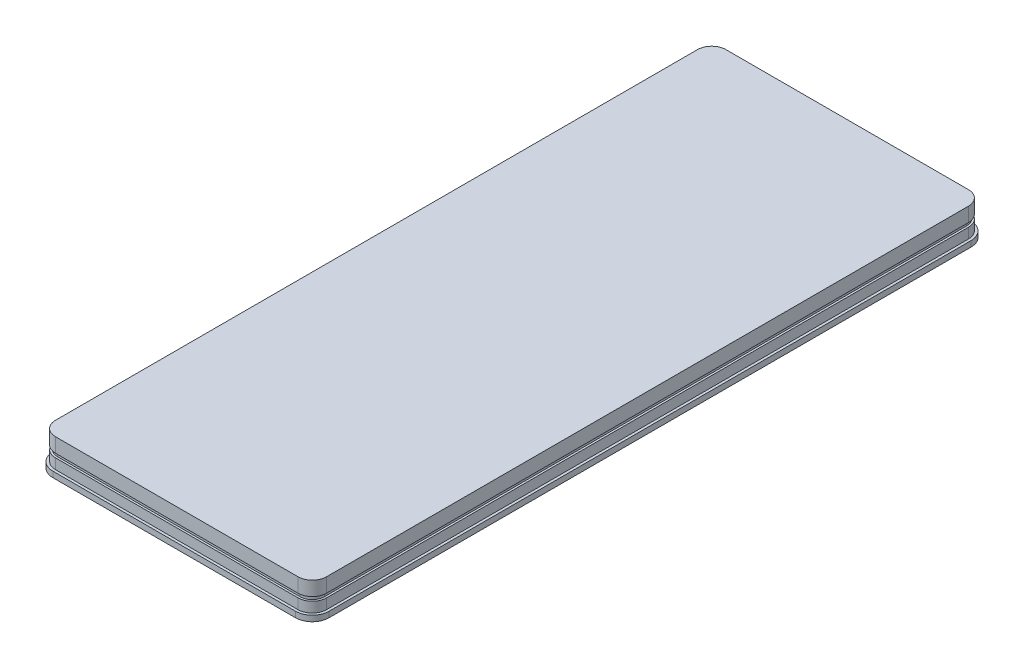
ISO-10303-21;
HEADER;
FILE_DESCRIPTION(('STEP AP214'),'2;1');
FILE_NAME('part.step','',(''),(''),'','','');
FILE_SCHEMA(('AUTOMOTIVE_DESIGN { 1 0 10303 214 1 1 1 1 }'));
ENDSEC;
DATA;
#1=APPLICATION_CONTEXT('core data for automotive mechanical design processes');
#2=APPLICATION_PROTOCOL_DEFINITION('international standard','automotive_design',2000,#1);
#3=PRODUCT_CONTEXT('',#1,'mechanical');
#4=PRODUCT('Part','Part','',(#3));
#5=PRODUCT_RELATED_PRODUCT_CATEGORY('part','',(#4));
#6=PRODUCT_DEFINITION_FORMATION('','',#4);
#7=PRODUCT_DEFINITION_CONTEXT('part definition',#1,'design');
#8=PRODUCT_DEFINITION('design','',#6,#7);
#9=PRODUCT_DEFINITION_SHAPE('','',#8);
#10=(LENGTH_UNIT() NAMED_UNIT(*) SI_UNIT(.MILLI.,.METRE.));
#11=(NAMED_UNIT(*) PLANE_ANGLE_UNIT() SI_UNIT($,.RADIAN.));
#12=(NAMED_UNIT(*) SI_UNIT($,.STERADIAN.) SOLID_ANGLE_UNIT());
#13=UNCERTAINTY_MEASURE_WITH_UNIT(LENGTH_MEASURE(1.E-05),#10,'distance_accuracy_value','');
#14=(GEOMETRIC_REPRESENTATION_CONTEXT(3) GLOBAL_UNCERTAINTY_ASSIGNED_CONTEXT((#13)) GLOBAL_UNIT_ASSIGNED_CONTEXT((#10,
#11,#12)) REPRESENTATION_CONTEXT('',''));
#15=CARTESIAN_POINT('',(0.,0.,0.));
#16=DIRECTION('',(0.,0.,1.));
#17=DIRECTION('',(1.,0.,0.));
#18=AXIS2_PLACEMENT_3D('',#15,#16,#17);
#19=CARTESIAN_POINT('',(-42.5,10.,112.5));
#20=DIRECTION('',(0.,-1.,0.));
#21=DIRECTION('',(0.,0.,-1.));
#22=AXIS2_PLACEMENT_3D('',#19,#20,#21);
#23=CYLINDRICAL_SURFACE('',#22,5.);
#24=CARTESIAN_POINT('',(-42.5,3.6,112.5));
#25=DIRECTION('',(0.,1.,0.));
#26=DIRECTION('',(0.,0.,1.));
#27=AXIS2_PLACEMENT_3D('',#24,#25,#26);
#28=CIRCLE('',#27,5.);
#29=CARTESIAN_POINT('',(-47.5,3.6,112.5));
#30=VERTEX_POINT('',#29);
#31=CARTESIAN_POINT('',(-42.5,3.6,117.5));
#32=VERTEX_POINT('',#31);
#33=EDGE_CURVE('E290',#30,#32,#28,.T.);
#34=ORIENTED_EDGE('',*,*,#33,.F.);
#35=DIRECTION('',(0.,-1.,0.));
#36=VECTOR('',#35,1.);
#37=CARTESIAN_POINT('',(-47.5,10.,112.5));
#38=LINE('',#37,#36);
#39=CARTESIAN_POINT('',(-47.5,0.,112.5));
#40=VERTEX_POINT('',#39);
#41=EDGE_CURVE('E430',#30,#40,#38,.T.);
#42=ORIENTED_EDGE('',*,*,#41,.T.);
#43=CARTESIAN_POINT('',(-42.5,0.,112.5));
#44=DIRECTION('',(0.,1.,0.));
#45=DIRECTION('',(0.,0.,1.));
#46=AXIS2_PLACEMENT_3D('',#43,#44,#45);
#47=CIRCLE('',#46,5.);
#48=CARTESIAN_POINT('',(-42.5,0.,117.5));
#49=VERTEX_POINT('',#48);
#50=EDGE_CURVE('E411',#40,#49,#47,.T.);
#51=ORIENTED_EDGE('',*,*,#50,.T.);
#52=DIRECTION('',(0.,-1.,0.));
#53=VECTOR('',#52,1.);
#54=CARTESIAN_POINT('',(-42.5,10.,117.5));
#55=LINE('',#54,#53);
#56=EDGE_CURVE('E45',#32,#49,#55,.T.);
#57=ORIENTED_EDGE('',*,*,#56,.F.);
#58=EDGE_LOOP('',(#34,#42,#51,#57));
#59=FACE_BOUND('',#58,.T.);
#60=ADVANCED_FACE('F37',(#59),#23,.T.);
#61=CARTESIAN_POINT('',(-42.5,10.,117.5));
#62=DIRECTION('',(0.,0.,-1.));
#63=DIRECTION('',(-1.,0.,0.));
#64=AXIS2_PLACEMENT_3D('',#61,#62,#63);
#65=PLANE('',#64);
#66=DIRECTION('',(1.,0.,0.));
#67=VECTOR('',#66,1.);
#68=CARTESIAN_POINT('',(0.,3.6,117.5));
#69=LINE('',#68,#67);
#70=CARTESIAN_POINT('',(42.5,3.6,117.5));
#71=VERTEX_POINT('',#70);
#72=EDGE_CURVE('E292',#32,#71,#69,.T.);
#73=ORIENTED_EDGE('',*,*,#72,.F.);
#74=ORIENTED_EDGE('',*,*,#56,.T.);
#75=DIRECTION('',(1.,0.,0.));
#76=VECTOR('',#75,1.);
#77=CARTESIAN_POINT('',(-42.5,0.,117.5));
#78=LINE('',#77,#76);
#79=CARTESIAN_POINT('',(42.5,0.,117.5));
#80=VERTEX_POINT('',#79);
#81=EDGE_CURVE('E433',#49,#80,#78,.T.);
#82=ORIENTED_EDGE('',*,*,#81,.T.);
#83=DIRECTION('',(0.,-1.,0.));
#84=VECTOR('',#83,1.);
#85=CARTESIAN_POINT('',(42.5,10.,117.5));
#86=LINE('',#85,#84);
#87=EDGE_CURVE('E475',#71,#80,#86,.T.);
#88=ORIENTED_EDGE('',*,*,#87,.F.);
#89=EDGE_LOOP('',(#73,#74,#82,#88));
#90=FACE_BOUND('',#89,.T.);
#91=ADVANCED_FACE('F496',(#90),#65,.F.);
#92=CARTESIAN_POINT('',(42.5,10.,112.5));
#93=DIRECTION('',(0.,-1.,0.));
#94=DIRECTION('',(0.,0.,-1.));
#95=AXIS2_PLACEMENT_3D('',#92,#93,#94);
#96=CYLINDRICAL_SURFACE('',#95,5.);
#97=CARTESIAN_POINT('',(42.5,3.6,112.5));
#98=DIRECTION('',(0.,1.,0.));
#99=DIRECTION('',(0.,0.,1.));
#100=AXIS2_PLACEMENT_3D('',#97,#98,#99);
#101=CIRCLE('',#100,5.);
#102=CARTESIAN_POINT('',(47.5,3.6,112.5));
#103=VERTEX_POINT('',#102);
#104=EDGE_CURVE('E294',#71,#103,#101,.T.);
#105=ORIENTED_EDGE('',*,*,#104,.F.);
#106=ORIENTED_EDGE('',*,*,#87,.T.);
#107=CARTESIAN_POINT('',(42.5,0.,112.5));
#108=DIRECTION('',(0.,1.,0.));
#109=DIRECTION('',(0.,0.,1.));
#110=AXIS2_PLACEMENT_3D('',#107,#108,#109);
#111=CIRCLE('',#110,5.);
#112=CARTESIAN_POINT('',(47.5,0.,112.5));
#113=VERTEX_POINT('',#112);
#114=EDGE_CURVE('E436',#80,#113,#111,.T.);
#115=ORIENTED_EDGE('',*,*,#114,.T.);
#116=DIRECTION('',(0.,-1.,0.));
#117=VECTOR('',#116,1.);
#118=CARTESIAN_POINT('',(47.5,10.,112.5));
#119=LINE('',#118,#117);
#120=EDGE_CURVE('E472',#103,#113,#119,.T.);
#121=ORIENTED_EDGE('',*,*,#120,.F.);
#122=EDGE_LOOP('',(#105,#106,#115,#121));
#123=FACE_BOUND('',#122,.T.);
#124=ADVANCED_FACE('F485',(#123),#96,.T.);
#125=CARTESIAN_POINT('',(47.5,10.,112.5));
#126=DIRECTION('',(-1.,0.,0.));
#127=DIRECTION('',(0.,0.,1.));
#128=AXIS2_PLACEMENT_3D('',#125,#126,#127);
#129=PLANE('',#128);
#130=DIRECTION('',(0.,0.,-1.));
#131=VECTOR('',#130,1.);
#132=CARTESIAN_POINT('',(47.5,3.6,0.));
#133=LINE('',#132,#131);
#134=CARTESIAN_POINT('',(47.5,3.6,-112.5));
#135=VERTEX_POINT('',#134);
#136=EDGE_CURVE('E296',#103,#135,#133,.T.);
#137=ORIENTED_EDGE('',*,*,#136,.F.);
#138=ORIENTED_EDGE('',*,*,#120,.T.);
#139=DIRECTION('',(0.,0.,-1.));
#140=VECTOR('',#139,1.);
#141=CARTESIAN_POINT('',(47.5,0.,112.5));
#142=LINE('',#141,#140);
#143=CARTESIAN_POINT('',(47.5,0.,-112.5));
#144=VERTEX_POINT('',#143);
#145=EDGE_CURVE('E439',#113,#144,#142,.T.);
#146=ORIENTED_EDGE('',*,*,#145,.T.);
#147=DIRECTION('',(0.,-1.,0.));
#148=VECTOR('',#147,1.);
#149=CARTESIAN_POINT('',(47.5,10.,-112.5));
#150=LINE('',#149,#148);
#151=EDGE_CURVE('E468',#135,#144,#150,.T.);
#152=ORIENTED_EDGE('',*,*,#151,.F.);
#153=EDGE_LOOP('',(#137,#138,#146,#152));
#154=FACE_BOUND('',#153,.T.);
#155=ADVANCED_FACE('F520',(#154),#129,.F.);
#156=CARTESIAN_POINT('',(42.5,10.,-112.5));
#157=DIRECTION('',(0.,-1.,0.));
#158=DIRECTION('',(0.,0.,-1.));
#159=AXIS2_PLACEMENT_3D('',#156,#157,#158);
#160=CYLINDRICAL_SURFACE('',#159,5.);
#161=CARTESIAN_POINT('',(42.5,3.6,-112.5));
#162=DIRECTION('',(0.,1.,0.));
#163=DIRECTION('',(0.,0.,1.));
#164=AXIS2_PLACEMENT_3D('',#161,#162,#163);
#165=CIRCLE('',#164,5.);
#166=CARTESIAN_POINT('',(42.4999999999999,3.6,-117.5));
#167=VERTEX_POINT('',#166);
#168=EDGE_CURVE('E298',#135,#167,#165,.T.);
#169=ORIENTED_EDGE('',*,*,#168,.F.);
#170=ORIENTED_EDGE('',*,*,#151,.T.);
#171=CARTESIAN_POINT('',(42.5,0.,-112.5));
#172=DIRECTION('',(0.,1.,0.));
#173=DIRECTION('',(0.,0.,1.));
#174=AXIS2_PLACEMENT_3D('',#171,#172,#173);
#175=CIRCLE('',#174,5.);
#176=CARTESIAN_POINT('',(42.5,0.,-117.5));
#177=VERTEX_POINT('',#176);
#178=EDGE_CURVE('E442',#144,#177,#175,.T.);
#179=ORIENTED_EDGE('',*,*,#178,.T.);
#180=DIRECTION('',(0.,-1.,0.));
#181=VECTOR('',#180,1.);
#182=CARTESIAN_POINT('',(42.5,10.,-117.5));
#183=LINE('',#182,#181);
#184=EDGE_CURVE('E464',#167,#177,#183,.T.);
#185=ORIENTED_EDGE('',*,*,#184,.F.);
#186=EDGE_LOOP('',(#169,#170,#179,#185));
#187=FACE_BOUND('',#186,.T.);
#188=ADVANCED_FACE('F516',(#187),#160,.T.);
#189=CARTESIAN_POINT('',(-42.5,10.,-117.5));
#190=DIRECTION('',(0.,0.,1.));
#191=DIRECTION('',(1.,0.,0.));
#192=AXIS2_PLACEMENT_3D('',#189,#190,#191);
#193=PLANE('',#192);
#194=DIRECTION('',(-1.,0.,0.));
#195=VECTOR('',#194,1.);
#196=CARTESIAN_POINT('',(0.,3.6,-117.5));
#197=LINE('',#196,#195);
#198=CARTESIAN_POINT('',(-42.5,3.6,-117.5));
#199=VERTEX_POINT('',#198);
#200=EDGE_CURVE('E300',#167,#199,#197,.T.);
#201=ORIENTED_EDGE('',*,*,#200,.F.);
#202=ORIENTED_EDGE('',*,*,#184,.T.);
#203=DIRECTION('',(-1.,0.,0.));
#204=VECTOR('',#203,1.);
#205=CARTESIAN_POINT('',(-42.5,0.,-117.5));
#206=LINE('',#205,#204);
#207=CARTESIAN_POINT('',(-42.5,0.,-117.5));
#208=VERTEX_POINT('',#207);
#209=EDGE_CURVE('E445',#177,#208,#206,.T.);
#210=ORIENTED_EDGE('',*,*,#209,.T.);
#211=DIRECTION('',(0.,-1.,0.));
#212=VECTOR('',#211,1.);
#213=CARTESIAN_POINT('',(-42.5,10.,-117.5));
#214=LINE('',#213,#212);
#215=EDGE_CURVE('E460',#199,#208,#214,.T.);
#216=ORIENTED_EDGE('',*,*,#215,.F.);
#217=EDGE_LOOP('',(#201,#202,#210,#216));
#218=FACE_BOUND('',#217,.T.);
#219=ADVANCED_FACE('F512',(#218),#193,.F.);
#220=CARTESIAN_POINT('',(-42.5,10.,-112.5));
#221=DIRECTION('',(0.,-1.,0.));
#222=DIRECTION('',(0.,0.,-1.));
#223=AXIS2_PLACEMENT_3D('',#220,#221,#222);
#224=CYLINDRICAL_SURFACE('',#223,5.);
#225=CARTESIAN_POINT('',(-42.5,3.6,-112.5));
#226=DIRECTION('',(0.,1.,0.));
#227=DIRECTION('',(0.,0.,1.));
#228=AXIS2_PLACEMENT_3D('',#225,#226,#227);
#229=CIRCLE('',#228,5.);
#230=CARTESIAN_POINT('',(-47.5,3.6,-112.5));
#231=VERTEX_POINT('',#230);
#232=EDGE_CURVE('E52',#199,#231,#229,.T.);
#233=ORIENTED_EDGE('',*,*,#232,.F.);
#234=ORIENTED_EDGE('',*,*,#215,.T.);
#235=CARTESIAN_POINT('',(-42.5,0.,-112.5));
#236=DIRECTION('',(0.,1.,0.));
#237=DIRECTION('',(0.,0.,-1.));
#238=AXIS2_PLACEMENT_3D('',#235,#236,#237);
#239=CIRCLE('',#238,5.);
#240=CARTESIAN_POINT('',(-47.5,0.,-112.5));
#241=VERTEX_POINT('',#240);
#242=EDGE_CURVE('E448',#208,#241,#239,.T.);
#243=ORIENTED_EDGE('',*,*,#242,.T.);
#244=DIRECTION('',(0.,-1.,0.));
#245=VECTOR('',#244,1.);
#246=CARTESIAN_POINT('',(-47.5,10.,-112.5));
#247=LINE('',#246,#245);
#248=EDGE_CURVE('E456',#231,#241,#247,.T.);
#249=ORIENTED_EDGE('',*,*,#248,.F.);
#250=EDGE_LOOP('',(#233,#234,#243,#249));
#251=FACE_BOUND('',#250,.T.);
#252=ADVANCED_FACE('F507',(#251),#224,.T.);
#253=CARTESIAN_POINT('',(-47.5,10.,112.5));
#254=DIRECTION('',(1.,0.,0.));
#255=DIRECTION('',(0.,0.,-1.));
#256=AXIS2_PLACEMENT_3D('',#253,#254,#255);
#257=PLANE('',#256);
#258=DIRECTION('',(0.,0.,1.));
#259=VECTOR('',#258,1.);
#260=CARTESIAN_POINT('',(-47.5,3.6,0.));
#261=LINE('',#260,#259);
#262=EDGE_CURVE('E288',#231,#30,#261,.T.);
#263=ORIENTED_EDGE('',*,*,#262,.F.);
#264=ORIENTED_EDGE('',*,*,#248,.T.);
#265=DIRECTION('',(0.,0.,1.));
#266=VECTOR('',#265,1.);
#267=CARTESIAN_POINT('',(-47.5,0.,112.5));
#268=LINE('',#267,#266);
#269=EDGE_CURVE('E416',#241,#40,#268,.T.);
#270=ORIENTED_EDGE('',*,*,#269,.T.);
#271=ORIENTED_EDGE('',*,*,#41,.F.);
#272=EDGE_LOOP('',(#263,#264,#270,#271));
#273=FACE_BOUND('',#272,.T.);
#274=ADVANCED_FACE('F504',(#273),#257,.F.);
#275=CARTESIAN_POINT('',(-42.5,-2.,112.5));
#276=DIRECTION('',(0.,1.,0.));
#277=DIRECTION('',(0.,0.,1.));
#278=AXIS2_PLACEMENT_3D('',#275,#276,#277);
#279=CYLINDRICAL_SURFACE('',#278,5.9);
#280=CARTESIAN_POINT('',(-42.5,0.,112.5));
#281=DIRECTION('',(0.,-1.,0.));
#282=DIRECTION('',(0.,0.,-1.));
#283=AXIS2_PLACEMENT_3D('',#280,#281,#282);
#284=CIRCLE('',#283,5.9);
#285=CARTESIAN_POINT('',(-42.5,0.,118.4));
#286=VERTEX_POINT('',#285);
#287=CARTESIAN_POINT('',(-48.4,0.,112.5));
#288=VERTEX_POINT('',#287);
#289=EDGE_CURVE('E337',#286,#288,#284,.T.);
#290=ORIENTED_EDGE('',*,*,#289,.T.);
#291=DIRECTION('',(0.,1.,0.));
#292=VECTOR('',#291,1.);
#293=CARTESIAN_POINT('',(-48.4,-2.,112.5));
#294=LINE('',#293,#292);
#295=CARTESIAN_POINT('',(-48.4,-2.,112.5));
#296=VERTEX_POINT('',#295);
#297=EDGE_CURVE('E408',#296,#288,#294,.T.);
#298=ORIENTED_EDGE('',*,*,#297,.F.);
#299=CARTESIAN_POINT('',(-42.5,-2.,112.5));
#300=DIRECTION('',(0.,-1.,0.));
#301=DIRECTION('',(0.,0.,-1.));
#302=AXIS2_PLACEMENT_3D('',#299,#300,#301);
#303=CIRCLE('',#302,5.9);
#304=CARTESIAN_POINT('',(-42.5,-2.,118.4));
#305=VERTEX_POINT('',#304);
#306=EDGE_CURVE('E354',#305,#296,#303,.T.);
#307=ORIENTED_EDGE('',*,*,#306,.F.);
#308=DIRECTION('',(0.,1.,0.));
#309=VECTOR('',#308,1.);
#310=CARTESIAN_POINT('',(-42.5,-2.,118.4));
#311=LINE('',#310,#309);
#312=EDGE_CURVE('E372',#305,#286,#311,.T.);
#313=ORIENTED_EDGE('',*,*,#312,.T.);
#314=EDGE_LOOP('',(#290,#298,#307,#313));
#315=FACE_BOUND('',#314,.T.);
#316=ADVANCED_FACE('F579',(#315),#279,.T.);
#317=CARTESIAN_POINT('',(-48.4,-2.,112.5));
#318=DIRECTION('',(1.,0.,0.));
#319=DIRECTION('',(0.,0.,-1.));
#320=AXIS2_PLACEMENT_3D('',#317,#318,#319);
#321=PLANE('',#320);
#322=DIRECTION('',(0.,0.,-1.));
#323=VECTOR('',#322,1.);
#324=CARTESIAN_POINT('',(-48.4,0.,112.5));
#325=LINE('',#324,#323);
#326=CARTESIAN_POINT('',(-48.4,0.,-112.5));
#327=VERTEX_POINT('',#326);
#328=EDGE_CURVE('E375',#288,#327,#325,.T.);
#329=ORIENTED_EDGE('',*,*,#328,.T.);
#330=DIRECTION('',(0.,1.,0.));
#331=VECTOR('',#330,1.);
#332=CARTESIAN_POINT('',(-48.4,-2.,-112.5));
#333=LINE('',#332,#331);
#334=CARTESIAN_POINT('',(-48.4,-2.,-112.5));
#335=VERTEX_POINT('',#334);
#336=EDGE_CURVE('E405',#335,#327,#333,.T.);
#337=ORIENTED_EDGE('',*,*,#336,.F.);
#338=DIRECTION('',(0.,0.,-1.));
#339=VECTOR('',#338,1.);
#340=CARTESIAN_POINT('',(-48.4,-2.,112.5));
#341=LINE('',#340,#339);
#342=EDGE_CURVE('E357',#296,#335,#341,.T.);
#343=ORIENTED_EDGE('',*,*,#342,.F.);
#344=ORIENTED_EDGE('',*,*,#297,.T.);
#345=EDGE_LOOP('',(#329,#337,#343,#344));
#346=FACE_BOUND('',#345,.T.);
#347=ADVANCED_FACE('F612',(#346),#321,.F.);
#348=CARTESIAN_POINT('',(-42.5,-2.,-112.5));
#349=DIRECTION('',(0.,1.,0.));
#350=DIRECTION('',(0.,0.,1.));
#351=AXIS2_PLACEMENT_3D('',#348,#349,#350);
#352=CYLINDRICAL_SURFACE('',#351,5.9);
#353=CARTESIAN_POINT('',(-42.5,0.,-112.5));
#354=DIRECTION('',(0.,-1.,0.));
#355=DIRECTION('',(0.,0.,-1.));
#356=AXIS2_PLACEMENT_3D('',#353,#354,#355);
#357=CIRCLE('',#356,5.9);
#358=CARTESIAN_POINT('',(-42.5,0.,-118.4));
#359=VERTEX_POINT('',#358);
#360=EDGE_CURVE('E377',#327,#359,#357,.T.);
#361=ORIENTED_EDGE('',*,*,#360,.T.);
#362=DIRECTION('',(0.,1.,0.));
#363=VECTOR('',#362,1.);
#364=CARTESIAN_POINT('',(-42.5,-2.,-118.4));
#365=LINE('',#364,#363);
#366=CARTESIAN_POINT('',(-42.5,-2.,-118.4));
#367=VERTEX_POINT('',#366);
#368=EDGE_CURVE('E402',#367,#359,#365,.T.);
#369=ORIENTED_EDGE('',*,*,#368,.F.);
#370=CARTESIAN_POINT('',(-42.5,-2.,-112.5));
#371=DIRECTION('',(0.,-1.,0.));
#372=DIRECTION('',(0.,0.,-1.));
#373=AXIS2_PLACEMENT_3D('',#370,#371,#372);
#374=CIRCLE('',#373,5.9);
#375=EDGE_CURVE('E360',#335,#367,#374,.T.);
#376=ORIENTED_EDGE('',*,*,#375,.F.);
#377=ORIENTED_EDGE('',*,*,#336,.T.);
#378=EDGE_LOOP('',(#361,#369,#376,#377));
#379=FACE_BOUND('',#378,.T.);
#380=ADVANCED_FACE('F617',(#379),#352,.T.);
#381=CARTESIAN_POINT('',(-42.5,-2.,-118.4));
#382=DIRECTION('',(0.,0.,1.));
#383=DIRECTION('',(1.,0.,0.));
#384=AXIS2_PLACEMENT_3D('',#381,#382,#383);
#385=PLANE('',#384);
#386=DIRECTION('',(1.,0.,0.));
#387=VECTOR('',#386,1.);
#388=CARTESIAN_POINT('',(-42.5,0.,-118.4));
#389=LINE('',#388,#387);
#390=CARTESIAN_POINT('',(42.5,0.,-118.4));
#391=VERTEX_POINT('',#390);
#392=EDGE_CURVE('E379',#359,#391,#389,.T.);
#393=ORIENTED_EDGE('',*,*,#392,.T.);
#394=DIRECTION('',(0.,1.,0.));
#395=VECTOR('',#394,1.);
#396=CARTESIAN_POINT('',(42.5,-2.,-118.4));
#397=LINE('',#396,#395);
#398=CARTESIAN_POINT('',(42.5,-2.,-118.4));
#399=VERTEX_POINT('',#398);
#400=EDGE_CURVE('E399',#399,#391,#397,.T.);
#401=ORIENTED_EDGE('',*,*,#400,.F.);
#402=DIRECTION('',(1.,0.,0.));
#403=VECTOR('',#402,1.);
#404=CARTESIAN_POINT('',(-42.5,-2.,-118.4));
#405=LINE('',#404,#403);
#406=EDGE_CURVE('E362',#367,#399,#405,.T.);
#407=ORIENTED_EDGE('',*,*,#406,.F.);
#408=ORIENTED_EDGE('',*,*,#368,.T.);
#409=EDGE_LOOP('',(#393,#401,#407,#408));
#410=FACE_BOUND('',#409,.T.);
#411=ADVANCED_FACE('F651',(#410),#385,.F.);
#412=CARTESIAN_POINT('',(42.5,-2.,-112.5));
#413=DIRECTION('',(0.,1.,0.));
#414=DIRECTION('',(0.,0.,1.));
#415=AXIS2_PLACEMENT_3D('',#412,#413,#414);
#416=CYLINDRICAL_SURFACE('',#415,5.9);
#417=CARTESIAN_POINT('',(42.5,0.,-112.5));
#418=DIRECTION('',(0.,-1.,0.));
#419=DIRECTION('',(0.,0.,-1.));
#420=AXIS2_PLACEMENT_3D('',#417,#418,#419);
#421=CIRCLE('',#420,5.9);
#422=CARTESIAN_POINT('',(48.4,0.,-112.5));
#423=VERTEX_POINT('',#422);
#424=EDGE_CURVE('E381',#391,#423,#421,.T.);
#425=ORIENTED_EDGE('',*,*,#424,.T.);
#426=DIRECTION('',(0.,1.,0.));
#427=VECTOR('',#426,1.);
#428=CARTESIAN_POINT('',(48.4,-2.,-112.5));
#429=LINE('',#428,#427);
#430=CARTESIAN_POINT('',(48.4,-2.,-112.5));
#431=VERTEX_POINT('',#430);
#432=EDGE_CURVE('E396',#431,#423,#429,.T.);
#433=ORIENTED_EDGE('',*,*,#432,.F.);
#434=CARTESIAN_POINT('',(42.5,-2.,-112.5));
#435=DIRECTION('',(0.,-1.,0.));
#436=DIRECTION('',(0.,0.,-1.));
#437=AXIS2_PLACEMENT_3D('',#434,#435,#436);
#438=CIRCLE('',#437,5.9);
#439=EDGE_CURVE('E364',#399,#431,#438,.T.);
#440=ORIENTED_EDGE('',*,*,#439,.F.);
#441=ORIENTED_EDGE('',*,*,#400,.T.);
#442=EDGE_LOOP('',(#425,#433,#440,#441));
#443=FACE_BOUND('',#442,.T.);
#444=ADVANCED_FACE('F647',(#443),#416,.T.);
#445=CARTESIAN_POINT('',(48.4,-2.,-112.5));
#446=DIRECTION('',(-1.,0.,0.));
#447=DIRECTION('',(0.,0.,1.));
#448=AXIS2_PLACEMENT_3D('',#445,#446,#447);
#449=PLANE('',#448);
#450=DIRECTION('',(0.,0.,1.));
#451=VECTOR('',#450,1.);
#452=CARTESIAN_POINT('',(48.4,0.,-112.5));
#453=LINE('',#452,#451);
#454=CARTESIAN_POINT('',(48.4,0.,112.5));
#455=VERTEX_POINT('',#454);
#456=EDGE_CURVE('E383',#423,#455,#453,.T.);
#457=ORIENTED_EDGE('',*,*,#456,.T.);
#458=DIRECTION('',(0.,1.,0.));
#459=VECTOR('',#458,1.);
#460=CARTESIAN_POINT('',(48.4,-2.,112.5));
#461=LINE('',#460,#459);
#462=CARTESIAN_POINT('',(48.4,-2.,112.5));
#463=VERTEX_POINT('',#462);
#464=EDGE_CURVE('E393',#463,#455,#461,.T.);
#465=ORIENTED_EDGE('',*,*,#464,.F.);
#466=DIRECTION('',(0.,0.,1.));
#467=VECTOR('',#466,1.);
#468=CARTESIAN_POINT('',(48.4,-2.,-112.5));
#469=LINE('',#468,#467);
#470=EDGE_CURVE('E366',#431,#463,#469,.T.);
#471=ORIENTED_EDGE('',*,*,#470,.F.);
#472=ORIENTED_EDGE('',*,*,#432,.T.);
#473=EDGE_LOOP('',(#457,#465,#471,#472));
#474=FACE_BOUND('',#473,.T.);
#475=ADVANCED_FACE('F642',(#474),#449,.F.);
#476=CARTESIAN_POINT('',(42.5,-2.,112.5));
#477=DIRECTION('',(0.,1.,0.));
#478=DIRECTION('',(0.,0.,1.));
#479=AXIS2_PLACEMENT_3D('',#476,#477,#478);
#480=CYLINDRICAL_SURFACE('',#479,5.9);
#481=CARTESIAN_POINT('',(42.5,0.,112.5));
#482=DIRECTION('',(0.,-1.,0.));
#483=DIRECTION('',(0.,0.,-1.));
#484=AXIS2_PLACEMENT_3D('',#481,#482,#483);
#485=CIRCLE('',#484,5.9);
#486=CARTESIAN_POINT('',(42.5,0.,118.4));
#487=VERTEX_POINT('',#486);
#488=EDGE_CURVE('E385',#455,#487,#485,.T.);
#489=ORIENTED_EDGE('',*,*,#488,.T.);
#490=DIRECTION('',(0.,1.,0.));
#491=VECTOR('',#490,1.);
#492=CARTESIAN_POINT('',(42.5,-2.,118.4));
#493=LINE('',#492,#491);
#494=CARTESIAN_POINT('',(42.5,-2.,118.4));
#495=VERTEX_POINT('',#494);
#496=EDGE_CURVE('E390',#495,#487,#493,.T.);
#497=ORIENTED_EDGE('',*,*,#496,.F.);
#498=CARTESIAN_POINT('',(42.5,-2.,112.5));
#499=DIRECTION('',(0.,-1.,0.));
#500=DIRECTION('',(0.,0.,-1.));
#501=AXIS2_PLACEMENT_3D('',#498,#499,#500);
#502=CIRCLE('',#501,5.9);
#503=EDGE_CURVE('E368',#463,#495,#502,.T.);
#504=ORIENTED_EDGE('',*,*,#503,.F.);
#505=ORIENTED_EDGE('',*,*,#464,.T.);
#506=EDGE_LOOP('',(#489,#497,#504,#505));
#507=FACE_BOUND('',#506,.T.);
#508=ADVANCED_FACE('F637',(#507),#480,.T.);
#509=CARTESIAN_POINT('',(42.5,-2.,118.4));
#510=DIRECTION('',(0.,0.,-1.));
#511=DIRECTION('',(-1.,0.,0.));
#512=AXIS2_PLACEMENT_3D('',#509,#510,#511);
#513=PLANE('',#512);
#514=DIRECTION('',(-1.,0.,0.));
#515=VECTOR('',#514,1.);
#516=CARTESIAN_POINT('',(42.5,0.,118.4));
#517=LINE('',#516,#515);
#518=EDGE_CURVE('E358',#487,#286,#517,.T.);
#519=ORIENTED_EDGE('',*,*,#518,.T.);
#520=ORIENTED_EDGE('',*,*,#312,.F.);
#521=DIRECTION('',(-1.,0.,0.));
#522=VECTOR('',#521,1.);
#523=CARTESIAN_POINT('',(42.5,-2.,118.4));
#524=LINE('',#523,#522);
#525=EDGE_CURVE('E370',#495,#305,#524,.T.);
#526=ORIENTED_EDGE('',*,*,#525,.F.);
#527=ORIENTED_EDGE('',*,*,#496,.T.);
#528=EDGE_LOOP('',(#519,#520,#526,#527));
#529=FACE_BOUND('',#528,.T.);
#530=ADVANCED_FACE('F635',(#529),#513,.F.);
#531=CARTESIAN_POINT('',(-42.5,-2.,112.5));
#532=DIRECTION('',(0.,-1.,0.));
#533=DIRECTION('',(0.,0.,-1.));
#534=AXIS2_PLACEMENT_3D('',#531,#532,#533);
#535=PLANE('',#534);
#536=ORIENTED_EDGE('',*,*,#306,.T.);
#537=ORIENTED_EDGE('',*,*,#342,.T.);
#538=ORIENTED_EDGE('',*,*,#375,.T.);
#539=ORIENTED_EDGE('',*,*,#406,.T.);
#540=ORIENTED_EDGE('',*,*,#439,.T.);
#541=ORIENTED_EDGE('',*,*,#470,.T.);
#542=ORIENTED_EDGE('',*,*,#503,.T.);
#543=ORIENTED_EDGE('',*,*,#525,.T.);
#544=EDGE_LOOP('',(#536,#537,#538,#539,#540,#541,#542,#543));
#545=FACE_BOUND('',#544,.T.);
#546=ADVANCED_FACE('F630',(#545),#535,.T.);
#547=CARTESIAN_POINT('',(-42.5,0.,112.5));
#548=DIRECTION('',(0.,-1.,0.));
#549=DIRECTION('',(0.,0.,-1.));
#550=AXIS2_PLACEMENT_3D('',#547,#548,#549);
#551=PLANE('',#550);
#552=ORIENTED_EDGE('',*,*,#50,.F.);
#553=ORIENTED_EDGE('',*,*,#269,.F.);
#554=ORIENTED_EDGE('',*,*,#242,.F.);
#555=ORIENTED_EDGE('',*,*,#209,.F.);
#556=ORIENTED_EDGE('',*,*,#178,.F.);
#557=ORIENTED_EDGE('',*,*,#145,.F.);
#558=ORIENTED_EDGE('',*,*,#114,.F.);
#559=ORIENTED_EDGE('',*,*,#81,.F.);
#560=EDGE_LOOP('',(#552,#553,#554,#555,#556,#557,#558,#559));
#561=FACE_BOUND('',#560,.T.);
#562=ORIENTED_EDGE('',*,*,#289,.F.);
#563=ORIENTED_EDGE('',*,*,#518,.F.);
#564=ORIENTED_EDGE('',*,*,#488,.F.);
#565=ORIENTED_EDGE('',*,*,#456,.F.);
#566=ORIENTED_EDGE('',*,*,#424,.F.);
#567=ORIENTED_EDGE('',*,*,#392,.F.);
#568=ORIENTED_EDGE('',*,*,#360,.F.);
#569=ORIENTED_EDGE('',*,*,#328,.F.);
#570=EDGE_LOOP('',(#562,#563,#564,#565,#566,#567,#568,#569));
#571=FACE_BOUND('',#570,.T.);
#572=ADVANCED_FACE('F493',(#561,#571),#551,.F.);
#573=CARTESIAN_POINT('',(-42.5,3.6,-112.5));
#574=DIRECTION('',(0.,1.,0.));
#575=DIRECTION('',(0.,0.,1.));
#576=AXIS2_PLACEMENT_3D('',#573,#574,#575);
#577=CYLINDRICAL_SURFACE('',#576,4.3);
#578=CARTESIAN_POINT('',(-42.5,5.,-112.5));
#579=DIRECTION('',(0.,1.,0.));
#580=DIRECTION('',(0.,0.,1.));
#581=AXIS2_PLACEMENT_3D('',#578,#579,#580);
#582=CIRCLE('',#581,4.3);
#583=CARTESIAN_POINT('',(-42.5,5.,-116.8));
#584=VERTEX_POINT('',#583);
#585=CARTESIAN_POINT('',(-46.8,5.,-112.5));
#586=VERTEX_POINT('',#585);
#587=EDGE_CURVE('E267',#584,#586,#582,.T.);
#588=ORIENTED_EDGE('',*,*,#587,.F.);
#589=DIRECTION('',(0.,1.,0.));
#590=VECTOR('',#589,1.);
#591=CARTESIAN_POINT('',(-42.5,3.6,-116.8));
#592=LINE('',#591,#590);
#593=CARTESIAN_POINT('',(-42.5,3.6,-116.8));
#594=VERTEX_POINT('',#593);
#595=EDGE_CURVE('E251',#594,#584,#592,.T.);
#596=ORIENTED_EDGE('',*,*,#595,.F.);
#597=CARTESIAN_POINT('',(-42.5,3.6,-112.5));
#598=DIRECTION('',(0.,1.,0.));
#599=DIRECTION('',(0.,0.,1.));
#600=AXIS2_PLACEMENT_3D('',#597,#598,#599);
#601=CIRCLE('',#600,4.3);
#602=CARTESIAN_POINT('',(-46.8,3.6,-112.5));
#603=VERTEX_POINT('',#602);
#604=EDGE_CURVE('E259',#594,#603,#601,.T.);
#605=ORIENTED_EDGE('',*,*,#604,.T.);
#606=DIRECTION('',(0.,1.,0.));
#607=VECTOR('',#606,1.);
#608=CARTESIAN_POINT('',(-46.8,3.6,-112.5));
#609=LINE('',#608,#607);
#610=EDGE_CURVE('E335',#603,#586,#609,.T.);
#611=ORIENTED_EDGE('',*,*,#610,.T.);
#612=EDGE_LOOP('',(#588,#596,#605,#611));
#613=FACE_BOUND('',#612,.T.);
#614=ADVANCED_FACE('F263',(#613),#577,.T.);
#615=CARTESIAN_POINT('',(-46.8,3.6,0.));
#616=DIRECTION('',(-1.,0.,0.));
#617=DIRECTION('',(0.,0.,1.));
#618=AXIS2_PLACEMENT_3D('',#615,#616,#617);
#619=PLANE('',#618);
#620=DIRECTION('',(0.,0.,1.));
#621=VECTOR('',#620,1.);
#622=CARTESIAN_POINT('',(-46.8,5.,0.));
#623=LINE('',#622,#621);
#624=CARTESIAN_POINT('',(-46.8,5.,112.5));
#625=VERTEX_POINT('',#624);
#626=EDGE_CURVE('E316',#586,#625,#623,.T.);
#627=ORIENTED_EDGE('',*,*,#626,.F.);
#628=ORIENTED_EDGE('',*,*,#610,.F.);
#629=DIRECTION('',(0.,0.,1.));
#630=VECTOR('',#629,1.);
#631=CARTESIAN_POINT('',(-46.8,3.6,0.));
#632=LINE('',#631,#630);
#633=CARTESIAN_POINT('',(-46.8,3.6,112.5));
#634=VERTEX_POINT('',#633);
#635=EDGE_CURVE('E271',#603,#634,#632,.T.);
#636=ORIENTED_EDGE('',*,*,#635,.T.);
#637=DIRECTION('',(0.,1.,0.));
#638=VECTOR('',#637,1.);
#639=CARTESIAN_POINT('',(-46.8,3.6,112.5));
#640=LINE('',#639,#638);
#641=EDGE_CURVE('E338',#634,#625,#640,.T.);
#642=ORIENTED_EDGE('',*,*,#641,.T.);
#643=EDGE_LOOP('',(#627,#628,#636,#642));
#644=FACE_BOUND('',#643,.T.);
#645=ADVANCED_FACE('F674',(#644),#619,.T.);
#646=CARTESIAN_POINT('',(-42.5,3.6,112.5));
#647=DIRECTION('',(0.,1.,0.));
#648=DIRECTION('',(0.,0.,1.));
#649=AXIS2_PLACEMENT_3D('',#646,#647,#648);
#650=CYLINDRICAL_SURFACE('',#649,4.3);
#651=CARTESIAN_POINT('',(-42.5,5.,112.5));
#652=DIRECTION('',(0.,1.,0.));
#653=DIRECTION('',(0.,0.,1.));
#654=AXIS2_PLACEMENT_3D('',#651,#652,#653);
#655=CIRCLE('',#654,4.3);
#656=CARTESIAN_POINT('',(-42.5,5.,116.8));
#657=VERTEX_POINT('',#656);
#658=EDGE_CURVE('E314',#625,#657,#655,.T.);
#659=ORIENTED_EDGE('',*,*,#658,.F.);
#660=ORIENTED_EDGE('',*,*,#641,.F.);
#661=CARTESIAN_POINT('',(-42.5,3.6,112.5));
#662=DIRECTION('',(0.,1.,0.));
#663=DIRECTION('',(0.,0.,1.));
#664=AXIS2_PLACEMENT_3D('',#661,#662,#663);
#665=CIRCLE('',#664,4.3);
#666=CARTESIAN_POINT('',(-42.5,3.6,116.8));
#667=VERTEX_POINT('',#666);
#668=EDGE_CURVE('E285',#634,#667,#665,.T.);
#669=ORIENTED_EDGE('',*,*,#668,.T.);
#670=DIRECTION('',(0.,1.,0.));
#671=VECTOR('',#670,1.);
#672=CARTESIAN_POINT('',(-42.5,3.6,116.8));
#673=LINE('',#672,#671);
#674=EDGE_CURVE('E341',#667,#657,#673,.T.);
#675=ORIENTED_EDGE('',*,*,#674,.T.);
#676=EDGE_LOOP('',(#659,#660,#669,#675));
#677=FACE_BOUND('',#676,.T.);
#678=ADVANCED_FACE('F690',(#677),#650,.T.);
#679=CARTESIAN_POINT('',(0.,3.6,116.8));
#680=DIRECTION('',(0.,0.,1.));
#681=DIRECTION('',(1.,0.,0.));
#682=AXIS2_PLACEMENT_3D('',#679,#680,#681);
#683=PLANE('',#682);
#684=DIRECTION('',(1.,0.,0.));
#685=VECTOR('',#684,1.);
#686=CARTESIAN_POINT('',(0.,5.,116.8));
#687=LINE('',#686,#685);
#688=CARTESIAN_POINT('',(42.5,5.,116.8));
#689=VERTEX_POINT('',#688);
#690=EDGE_CURVE('E312',#657,#689,#687,.T.);
#691=ORIENTED_EDGE('',*,*,#690,.F.);
#692=ORIENTED_EDGE('',*,*,#674,.F.);
#693=DIRECTION('',(1.,0.,0.));
#694=VECTOR('',#693,1.);
#695=CARTESIAN_POINT('',(0.,3.6,116.8));
#696=LINE('',#695,#694);
#697=CARTESIAN_POINT('',(42.5,3.6,116.8));
#698=VERTEX_POINT('',#697);
#699=EDGE_CURVE('E283',#667,#698,#696,.T.);
#700=ORIENTED_EDGE('',*,*,#699,.T.);
#701=DIRECTION('',(0.,1.,0.));
#702=VECTOR('',#701,1.);
#703=CARTESIAN_POINT('',(42.5,3.6,116.8));
#704=LINE('',#703,#702);
#705=EDGE_CURVE('E344',#698,#689,#704,.T.);
#706=ORIENTED_EDGE('',*,*,#705,.T.);
#707=EDGE_LOOP('',(#691,#692,#700,#706));
#708=FACE_BOUND('',#707,.T.);
#709=ADVANCED_FACE('F686',(#708),#683,.T.);
#710=CARTESIAN_POINT('',(42.5,3.6,112.5));
#711=DIRECTION('',(0.,1.,0.));
#712=DIRECTION('',(0.,0.,1.));
#713=AXIS2_PLACEMENT_3D('',#710,#711,#712);
#714=CYLINDRICAL_SURFACE('',#713,4.3);
#715=CARTESIAN_POINT('',(42.5,5.,112.5));
#716=DIRECTION('',(0.,1.,0.));
#717=DIRECTION('',(0.,0.,1.));
#718=AXIS2_PLACEMENT_3D('',#715,#716,#717);
#719=CIRCLE('',#718,4.3);
#720=CARTESIAN_POINT('',(46.8,5.,112.5));
#721=VERTEX_POINT('',#720);
#722=EDGE_CURVE('E310',#689,#721,#719,.T.);
#723=ORIENTED_EDGE('',*,*,#722,.F.);
#724=ORIENTED_EDGE('',*,*,#705,.F.);
#725=CARTESIAN_POINT('',(42.5,3.6,112.5));
#726=DIRECTION('',(0.,1.,0.));
#727=DIRECTION('',(0.,0.,1.));
#728=AXIS2_PLACEMENT_3D('',#725,#726,#727);
#729=CIRCLE('',#728,4.3);
#730=CARTESIAN_POINT('',(46.8,3.6,112.5));
#731=VERTEX_POINT('',#730);
#732=EDGE_CURVE('E281',#698,#731,#729,.T.);
#733=ORIENTED_EDGE('',*,*,#732,.T.);
#734=DIRECTION('',(0.,1.,0.));
#735=VECTOR('',#734,1.);
#736=CARTESIAN_POINT('',(46.8,3.6,112.5));
#737=LINE('',#736,#735);
#738=EDGE_CURVE('E347',#731,#721,#737,.T.);
#739=ORIENTED_EDGE('',*,*,#738,.T.);
#740=EDGE_LOOP('',(#723,#724,#733,#739));
#741=FACE_BOUND('',#740,.T.);
#742=ADVANCED_FACE('F682',(#741),#714,.T.);
#743=CARTESIAN_POINT('',(46.8,3.6,0.));
#744=DIRECTION('',(1.,0.,0.));
#745=DIRECTION('',(0.,0.,-1.));
#746=AXIS2_PLACEMENT_3D('',#743,#744,#745);
#747=PLANE('',#746);
#748=DIRECTION('',(0.,0.,-1.));
#749=VECTOR('',#748,1.);
#750=CARTESIAN_POINT('',(46.8,5.,0.));
#751=LINE('',#750,#749);
#752=CARTESIAN_POINT('',(46.8,5.,-112.5));
#753=VERTEX_POINT('',#752);
#754=EDGE_CURVE('E308',#721,#753,#751,.T.);
#755=ORIENTED_EDGE('',*,*,#754,.F.);
#756=ORIENTED_EDGE('',*,*,#738,.F.);
#757=DIRECTION('',(0.,0.,-1.));
#758=VECTOR('',#757,1.);
#759=CARTESIAN_POINT('',(46.8,3.6,0.));
#760=LINE('',#759,#758);
#761=CARTESIAN_POINT('',(46.8,3.6,-112.5));
#762=VERTEX_POINT('',#761);
#763=EDGE_CURVE('E279',#731,#762,#760,.T.);
#764=ORIENTED_EDGE('',*,*,#763,.T.);
#765=DIRECTION('',(0.,1.,0.));
#766=VECTOR('',#765,1.);
#767=CARTESIAN_POINT('',(46.8,3.6,-112.5));
#768=LINE('',#767,#766);
#769=EDGE_CURVE('E350',#762,#753,#768,.T.);
#770=ORIENTED_EDGE('',*,*,#769,.T.);
#771=EDGE_LOOP('',(#755,#756,#764,#770));
#772=FACE_BOUND('',#771,.T.);
#773=ADVANCED_FACE('F678',(#772),#747,.T.);
#774=CARTESIAN_POINT('',(42.5,3.6,-112.5));
#775=DIRECTION('',(0.,1.,0.));
#776=DIRECTION('',(0.,0.,1.));
#777=AXIS2_PLACEMENT_3D('',#774,#775,#776);
#778=CYLINDRICAL_SURFACE('',#777,4.3);
#779=CARTESIAN_POINT('',(42.5,5.,-112.5));
#780=DIRECTION('',(0.,1.,0.));
#781=DIRECTION('',(0.,0.,1.));
#782=AXIS2_PLACEMENT_3D('',#779,#780,#781);
#783=CIRCLE('',#782,4.3);
#784=CARTESIAN_POINT('',(42.5,5.,-116.8));
#785=VERTEX_POINT('',#784);
#786=EDGE_CURVE('E306',#753,#785,#783,.T.);
#787=ORIENTED_EDGE('',*,*,#786,.F.);
#788=ORIENTED_EDGE('',*,*,#769,.F.);
#789=CARTESIAN_POINT('',(42.5,3.6,-112.5));
#790=DIRECTION('',(0.,1.,0.));
#791=DIRECTION('',(0.,0.,1.));
#792=AXIS2_PLACEMENT_3D('',#789,#790,#791);
#793=CIRCLE('',#792,4.3);
#794=CARTESIAN_POINT('',(42.5,3.6,-116.8));
#795=VERTEX_POINT('',#794);
#796=EDGE_CURVE('E258',#762,#795,#793,.T.);
#797=ORIENTED_EDGE('',*,*,#796,.T.);
#798=DIRECTION('',(0.,1.,0.));
#799=VECTOR('',#798,1.);
#800=CARTESIAN_POINT('',(42.5,3.6,-116.8));
#801=LINE('',#800,#799);
#802=EDGE_CURVE('E254',#795,#785,#801,.T.);
#803=ORIENTED_EDGE('',*,*,#802,.T.);
#804=EDGE_LOOP('',(#787,#788,#797,#803));
#805=FACE_BOUND('',#804,.T.);
#806=ADVANCED_FACE('F531',(#805),#778,.T.);
#807=CARTESIAN_POINT('',(0.,3.6,-116.8));
#808=DIRECTION('',(0.,0.,-1.));
#809=DIRECTION('',(-1.,0.,0.));
#810=AXIS2_PLACEMENT_3D('',#807,#808,#809);
#811=PLANE('',#810);
#812=DIRECTION('',(-1.,0.,0.));
#813=VECTOR('',#812,1.);
#814=CARTESIAN_POINT('',(0.,5.,-116.8));
#815=LINE('',#814,#813);
#816=EDGE_CURVE('E304',#785,#584,#815,.T.);
#817=ORIENTED_EDGE('',*,*,#816,.F.);
#818=ORIENTED_EDGE('',*,*,#802,.F.);
#819=DIRECTION('',(-1.,0.,0.));
#820=VECTOR('',#819,1.);
#821=CARTESIAN_POINT('',(0.,3.6,-116.8));
#822=LINE('',#821,#820);
#823=EDGE_CURVE('E247',#795,#594,#822,.T.);
#824=ORIENTED_EDGE('',*,*,#823,.T.);
#825=ORIENTED_EDGE('',*,*,#595,.T.);
#826=EDGE_LOOP('',(#817,#818,#824,#825));
#827=FACE_BOUND('',#826,.T.);
#828=ADVANCED_FACE('F250',(#827),#811,.T.);
#829=CARTESIAN_POINT('',(0.,3.6,0.));
#830=DIRECTION('',(0.,1.,0.));
#831=DIRECTION('',(0.,0.,1.));
#832=AXIS2_PLACEMENT_3D('',#829,#830,#831);
#833=PLANE('',#832);
#834=ORIENTED_EDGE('',*,*,#604,.F.);
#835=ORIENTED_EDGE('',*,*,#823,.F.);
#836=ORIENTED_EDGE('',*,*,#796,.F.);
#837=ORIENTED_EDGE('',*,*,#763,.F.);
#838=ORIENTED_EDGE('',*,*,#732,.F.);
#839=ORIENTED_EDGE('',*,*,#699,.F.);
#840=ORIENTED_EDGE('',*,*,#668,.F.);
#841=ORIENTED_EDGE('',*,*,#635,.F.);
#842=EDGE_LOOP('',(#834,#835,#836,#837,#838,#839,#840,#841));
#843=FACE_BOUND('',#842,.T.);
#844=ORIENTED_EDGE('',*,*,#262,.T.);
#845=ORIENTED_EDGE('',*,*,#33,.T.);
#846=ORIENTED_EDGE('',*,*,#72,.T.);
#847=ORIENTED_EDGE('',*,*,#104,.T.);
#848=ORIENTED_EDGE('',*,*,#136,.T.);
#849=ORIENTED_EDGE('',*,*,#168,.T.);
#850=ORIENTED_EDGE('',*,*,#200,.T.);
#851=ORIENTED_EDGE('',*,*,#232,.T.);
#852=EDGE_LOOP('',(#844,#845,#846,#847,#848,#849,#850,#851));
#853=FACE_BOUND('',#852,.T.);
#854=ADVANCED_FACE('F269',(#843,#853),#833,.T.);
#855=CARTESIAN_POINT('',(0.,5.,0.));
#856=DIRECTION('',(0.,1.,0.));
#857=DIRECTION('',(0.,0.,1.));
#858=AXIS2_PLACEMENT_3D('',#855,#856,#857);
#859=PLANE('',#858);
#860=ORIENTED_EDGE('',*,*,#587,.T.);
#861=ORIENTED_EDGE('',*,*,#626,.T.);
#862=ORIENTED_EDGE('',*,*,#658,.T.);
#863=ORIENTED_EDGE('',*,*,#690,.T.);
#864=ORIENTED_EDGE('',*,*,#722,.T.);
#865=ORIENTED_EDGE('',*,*,#754,.T.);
#866=ORIENTED_EDGE('',*,*,#786,.T.);
#867=ORIENTED_EDGE('',*,*,#816,.T.);
#868=EDGE_LOOP('',(#860,#861,#862,#863,#864,#865,#866,#867));
#869=FACE_BOUND('',#868,.T.);
#870=DIRECTION('',(0.,0.,1.));
#871=VECTOR('',#870,1.);
#872=CARTESIAN_POINT('',(-47.5,5.,0.));
#873=LINE('',#872,#871);
#874=CARTESIAN_POINT('',(-47.5,5.,-112.5));
#875=VERTEX_POINT('',#874);
#876=CARTESIAN_POINT('',(-47.5,5.,112.5));
#877=VERTEX_POINT('',#876);
#878=EDGE_CURVE('E318',#875,#877,#873,.T.);
#879=ORIENTED_EDGE('',*,*,#878,.F.);
#880=CARTESIAN_POINT('',(-42.5,5.,-112.5));
#881=DIRECTION('',(0.,1.,0.));
#882=DIRECTION('',(0.,0.,1.));
#883=AXIS2_PLACEMENT_3D('',#880,#881,#882);
#884=CIRCLE('',#883,5.);
#885=CARTESIAN_POINT('',(-42.5,5.,-117.5));
#886=VERTEX_POINT('',#885);
#887=EDGE_CURVE('E272',#886,#875,#884,.T.);
#888=ORIENTED_EDGE('',*,*,#887,.F.);
#889=DIRECTION('',(-1.,0.,0.));
#890=VECTOR('',#889,1.);
#891=CARTESIAN_POINT('',(0.,5.,-117.5));
#892=LINE('',#891,#890);
#893=CARTESIAN_POINT('',(42.4999999999999,5.,-117.5));
#894=VERTEX_POINT('',#893);
#895=EDGE_CURVE('E275',#894,#886,#892,.T.);
#896=ORIENTED_EDGE('',*,*,#895,.F.);
#897=CARTESIAN_POINT('',(42.5,5.,-112.5));
#898=DIRECTION('',(0.,1.,0.));
#899=DIRECTION('',(0.,0.,1.));
#900=AXIS2_PLACEMENT_3D('',#897,#898,#899);
#901=CIRCLE('',#900,5.);
#902=CARTESIAN_POINT('',(47.5,5.,-112.5));
#903=VERTEX_POINT('',#902);
#904=EDGE_CURVE('E330',#903,#894,#901,.T.);
#905=ORIENTED_EDGE('',*,*,#904,.F.);
#906=DIRECTION('',(0.,0.,-1.));
#907=VECTOR('',#906,1.);
#908=CARTESIAN_POINT('',(47.5,5.,0.));
#909=LINE('',#908,#907);
#910=CARTESIAN_POINT('',(47.5,5.,112.5));
#911=VERTEX_POINT('',#910);
#912=EDGE_CURVE('E327',#911,#903,#909,.T.);
#913=ORIENTED_EDGE('',*,*,#912,.F.);
#914=CARTESIAN_POINT('',(42.5,5.,112.5));
#915=DIRECTION('',(0.,1.,0.));
#916=DIRECTION('',(0.,0.,1.));
#917=AXIS2_PLACEMENT_3D('',#914,#915,#916);
#918=CIRCLE('',#917,5.);
#919=CARTESIAN_POINT('',(42.5,5.,117.5));
#920=VERTEX_POINT('',#919);
#921=EDGE_CURVE('E324',#920,#911,#918,.T.);
#922=ORIENTED_EDGE('',*,*,#921,.F.);
#923=DIRECTION('',(1.,0.,0.));
#924=VECTOR('',#923,1.);
#925=CARTESIAN_POINT('',(0.,5.,117.5));
#926=LINE('',#925,#924);
#927=CARTESIAN_POINT('',(-42.5,5.,117.5));
#928=VERTEX_POINT('',#927);
#929=EDGE_CURVE('E321',#928,#920,#926,.T.);
#930=ORIENTED_EDGE('',*,*,#929,.F.);
#931=CARTESIAN_POINT('',(-42.5,5.,112.5));
#932=DIRECTION('',(0.,1.,0.));
#933=DIRECTION('',(0.,0.,1.));
#934=AXIS2_PLACEMENT_3D('',#931,#932,#933);
#935=CIRCLE('',#934,5.);
#936=EDGE_CURVE('E60',#877,#928,#935,.T.);
#937=ORIENTED_EDGE('',*,*,#936,.F.);
#938=EDGE_LOOP('',(#879,#888,#896,#905,#913,#922,#930,#937));
#939=FACE_BOUND('',#938,.T.);
#940=ADVANCED_FACE('F522',(#869,#939),#859,.F.);
#941=CARTESIAN_POINT('',(-42.5,10.,112.5));
#942=DIRECTION('',(0.,1.,0.));
#943=DIRECTION('',(0.,0.,1.));
#944=AXIS2_PLACEMENT_3D('',#941,#942,#943);
#945=PLANE('',#944);
#946=CARTESIAN_POINT('',(-42.5,10.,112.5));
#947=DIRECTION('',(0.,1.,0.));
#948=DIRECTION('',(0.,0.,1.));
#949=AXIS2_PLACEMENT_3D('',#946,#947,#948);
#950=CIRCLE('',#949,5.);
#951=CARTESIAN_POINT('',(-47.5,10.,112.5));
#952=VERTEX_POINT('',#951);
#953=CARTESIAN_POINT('',(-42.5,10.,117.5));
#954=VERTEX_POINT('',#953);
#955=EDGE_CURVE('E412',#952,#954,#950,.T.);
#956=ORIENTED_EDGE('',*,*,#955,.T.);
#957=DIRECTION('',(1.,0.,0.));
#958=VECTOR('',#957,1.);
#959=CARTESIAN_POINT('',(-42.5,10.,117.5));
#960=LINE('',#959,#958);
#961=CARTESIAN_POINT('',(42.5,10.,117.5));
#962=VERTEX_POINT('',#961);
#963=EDGE_CURVE('E415',#954,#962,#960,.T.);
#964=ORIENTED_EDGE('',*,*,#963,.T.);
#965=CARTESIAN_POINT('',(42.5,10.,112.5));
#966=DIRECTION('',(0.,1.,0.));
#967=DIRECTION('',(0.,0.,1.));
#968=AXIS2_PLACEMENT_3D('',#965,#966,#967);
#969=CIRCLE('',#968,5.);
#970=CARTESIAN_POINT('',(47.5,10.,112.5));
#971=VERTEX_POINT('',#970);
#972=EDGE_CURVE('E418',#962,#971,#969,.T.);
#973=ORIENTED_EDGE('',*,*,#972,.T.);
#974=DIRECTION('',(0.,0.,-1.));
#975=VECTOR('',#974,1.);
#976=CARTESIAN_POINT('',(47.5,10.,112.5));
#977=LINE('',#976,#975);
#978=CARTESIAN_POINT('',(47.5,10.,-112.5));
#979=VERTEX_POINT('',#978);
#980=EDGE_CURVE('E420',#971,#979,#977,.T.);
#981=ORIENTED_EDGE('',*,*,#980,.T.);
#982=CARTESIAN_POINT('',(42.5,10.,-112.5));
#983=DIRECTION('',(0.,1.,0.));
#984=DIRECTION('',(0.,0.,1.));
#985=AXIS2_PLACEMENT_3D('',#982,#983,#984);
#986=CIRCLE('',#985,5.);
#987=CARTESIAN_POINT('',(42.5,10.,-117.5));
#988=VERTEX_POINT('',#987);
#989=EDGE_CURVE('E422',#979,#988,#986,.T.);
#990=ORIENTED_EDGE('',*,*,#989,.T.);
#991=DIRECTION('',(-1.,0.,0.));
#992=VECTOR('',#991,1.);
#993=CARTESIAN_POINT('',(-42.5,10.,-117.5));
#994=LINE('',#993,#992);
#995=CARTESIAN_POINT('',(-42.5,10.,-117.5));
#996=VERTEX_POINT('',#995);
#997=EDGE_CURVE('E424',#988,#996,#994,.T.);
#998=ORIENTED_EDGE('',*,*,#997,.T.);
#999=CARTESIAN_POINT('',(-42.5,10.,-112.5));
#1000=DIRECTION('',(0.,1.,0.));
#1001=DIRECTION('',(0.,0.,-1.));
#1002=AXIS2_PLACEMENT_3D('',#999,#1000,#1001);
#1003=CIRCLE('',#1002,5.);
#1004=CARTESIAN_POINT('',(-47.5,10.,-112.5));
#1005=VERTEX_POINT('',#1004);
#1006=EDGE_CURVE('E426',#996,#1005,#1003,.T.);
#1007=ORIENTED_EDGE('',*,*,#1006,.T.);
#1008=DIRECTION('',(0.,0.,1.));
#1009=VECTOR('',#1008,1.);
#1010=CARTESIAN_POINT('',(-47.5,10.,112.5));
#1011=LINE('',#1010,#1009);
#1012=EDGE_CURVE('E428',#1005,#952,#1011,.T.);
#1013=ORIENTED_EDGE('',*,*,#1012,.T.);
#1014=EDGE_LOOP('',(#956,#964,#973,#981,#990,#998,#1007,#1013));
#1015=FACE_BOUND('',#1014,.T.);
#1016=ADVANCED_FACE('F528',(#1015),#945,.T.);
#1017=EDGE_CURVE('E457',#1005,#875,#247,.T.);
#1018=ORIENTED_EDGE('',*,*,#1017,.T.);
#1019=ORIENTED_EDGE('',*,*,#878,.T.);
#1020=EDGE_CURVE('E453',#952,#877,#38,.T.);
#1021=ORIENTED_EDGE('',*,*,#1020,.F.);
#1022=ORIENTED_EDGE('',*,*,#1012,.F.);
#1023=EDGE_LOOP('',(#1018,#1019,#1021,#1022));
#1024=FACE_BOUND('',#1023,.T.);
#1025=ADVANCED_FACE('F551',(#1024),#257,.F.);
#1026=EDGE_CURVE('E461',#996,#886,#214,.T.);
#1027=ORIENTED_EDGE('',*,*,#1026,.T.);
#1028=ORIENTED_EDGE('',*,*,#887,.T.);
#1029=ORIENTED_EDGE('',*,*,#1017,.F.);
#1030=ORIENTED_EDGE('',*,*,#1006,.F.);
#1031=EDGE_LOOP('',(#1027,#1028,#1029,#1030));
#1032=FACE_BOUND('',#1031,.T.);
#1033=ADVANCED_FACE('F554',(#1032),#224,.T.);
#1034=EDGE_CURVE('E465',#988,#894,#183,.T.);
#1035=ORIENTED_EDGE('',*,*,#1034,.T.);
#1036=ORIENTED_EDGE('',*,*,#895,.T.);
#1037=ORIENTED_EDGE('',*,*,#1026,.F.);
#1038=ORIENTED_EDGE('',*,*,#997,.F.);
#1039=EDGE_LOOP('',(#1035,#1036,#1037,#1038));
#1040=FACE_BOUND('',#1039,.T.);
#1041=ADVANCED_FACE('F559',(#1040),#193,.F.);
#1042=EDGE_CURVE('E469',#979,#903,#150,.T.);
#1043=ORIENTED_EDGE('',*,*,#1042,.T.);
#1044=ORIENTED_EDGE('',*,*,#904,.T.);
#1045=ORIENTED_EDGE('',*,*,#1034,.F.);
#1046=ORIENTED_EDGE('',*,*,#989,.F.);
#1047=EDGE_LOOP('',(#1043,#1044,#1045,#1046));
#1048=FACE_BOUND('',#1047,.T.);
#1049=ADVANCED_FACE('F562',(#1048),#160,.T.);
#1050=EDGE_CURVE('E473',#971,#911,#119,.T.);
#1051=ORIENTED_EDGE('',*,*,#1050,.T.);
#1052=ORIENTED_EDGE('',*,*,#912,.T.);
#1053=ORIENTED_EDGE('',*,*,#1042,.F.);
#1054=ORIENTED_EDGE('',*,*,#980,.F.);
#1055=EDGE_LOOP('',(#1051,#1052,#1053,#1054));
#1056=FACE_BOUND('',#1055,.T.);
#1057=ADVANCED_FACE('F567',(#1056),#129,.F.);
#1058=EDGE_CURVE('E476',#962,#920,#86,.T.);
#1059=ORIENTED_EDGE('',*,*,#1058,.T.);
#1060=ORIENTED_EDGE('',*,*,#921,.T.);
#1061=ORIENTED_EDGE('',*,*,#1050,.F.);
#1062=ORIENTED_EDGE('',*,*,#972,.F.);
#1063=EDGE_LOOP('',(#1059,#1060,#1061,#1062));
#1064=FACE_BOUND('',#1063,.T.);
#1065=ADVANCED_FACE('F544',(#1064),#96,.T.);
#1066=EDGE_CURVE('E11',#954,#928,#55,.T.);
#1067=ORIENTED_EDGE('',*,*,#1066,.T.);
#1068=ORIENTED_EDGE('',*,*,#929,.T.);
#1069=ORIENTED_EDGE('',*,*,#1058,.F.);
#1070=ORIENTED_EDGE('',*,*,#963,.F.);
#1071=EDGE_LOOP('',(#1067,#1068,#1069,#1070));
#1072=FACE_BOUND('',#1071,.T.);
#1073=ADVANCED_FACE('F538',(#1072),#65,.F.);
#1074=ORIENTED_EDGE('',*,*,#1020,.T.);
#1075=ORIENTED_EDGE('',*,*,#936,.T.);
#1076=ORIENTED_EDGE('',*,*,#1066,.F.);
#1077=ORIENTED_EDGE('',*,*,#955,.F.);
#1078=EDGE_LOOP('',(#1074,#1075,#1076,#1077));
#1079=FACE_BOUND('',#1078,.T.);
#1080=ADVANCED_FACE('F39',(#1079),#23,.T.);
#1081=CLOSED_SHELL('',(#60,#91,#124,#155,#188,#219,#252,#274,#316,#347,#380,#411,#444,#475,#508,
#530,#546,#572,#614,#645,#678,#709,#742,#773,#806,#828,#854,#940,#1016,#1025,#1033,#1041,#1049,
#1057,#1065,#1073,#1080));
#1082=MANIFOLD_SOLID_BREP('B2',#1081);
#1083=ADVANCED_BREP_SHAPE_REPRESENTATION('',(#18,#1082),#14);
#1084=SHAPE_DEFINITION_REPRESENTATION(#9,#1083);
ENDSEC;
END-ISO-10303-21;
